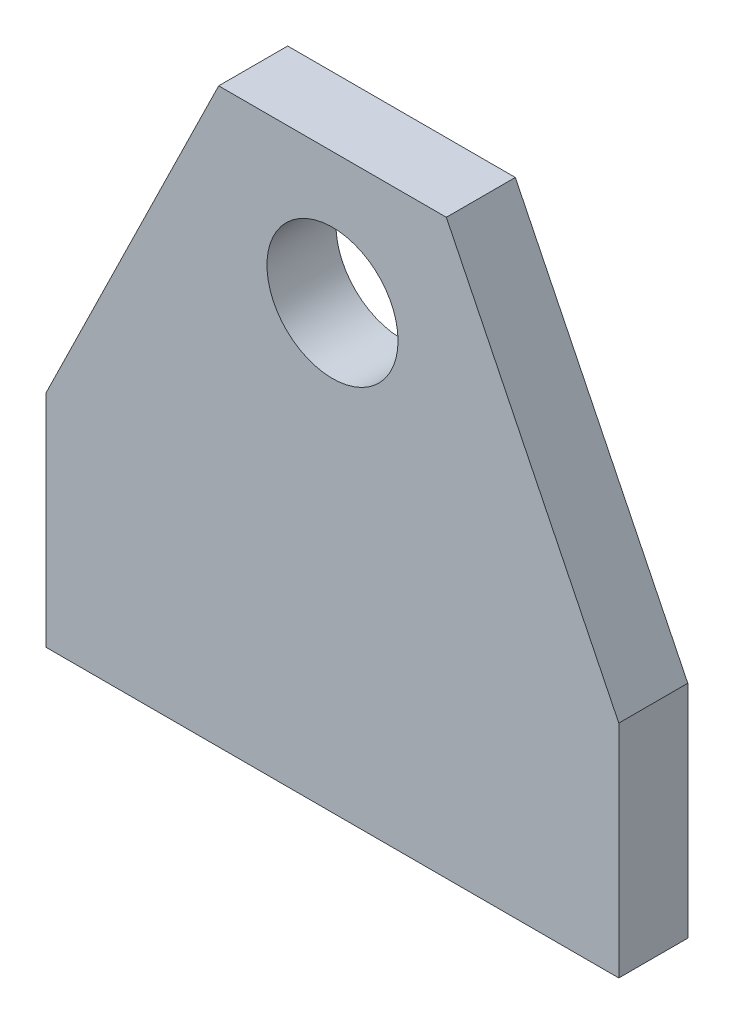
ISO-10303-21;
HEADER;
FILE_DESCRIPTION(('STEP AP214'),'2;1');
FILE_NAME('part.step','',(''),(''),'','','');
FILE_SCHEMA(('AUTOMOTIVE_DESIGN { 1 0 10303 214 1 1 1 1 }'));
ENDSEC;
DATA;
#1=APPLICATION_CONTEXT('core data for automotive mechanical design processes');
#2=APPLICATION_PROTOCOL_DEFINITION('international standard','automotive_design',2000,#1);
#3=PRODUCT_CONTEXT('',#1,'mechanical');
#4=PRODUCT('Part','Part','',(#3));
#5=PRODUCT_RELATED_PRODUCT_CATEGORY('part','',(#4));
#6=PRODUCT_DEFINITION_FORMATION('','',#4);
#7=PRODUCT_DEFINITION_CONTEXT('part definition',#1,'design');
#8=PRODUCT_DEFINITION('design','',#6,#7);
#9=PRODUCT_DEFINITION_SHAPE('','',#8);
#10=(LENGTH_UNIT() NAMED_UNIT(*) SI_UNIT(.MILLI.,.METRE.));
#11=(NAMED_UNIT(*) PLANE_ANGLE_UNIT() SI_UNIT($,.RADIAN.));
#12=(NAMED_UNIT(*) SI_UNIT($,.STERADIAN.) SOLID_ANGLE_UNIT());
#13=UNCERTAINTY_MEASURE_WITH_UNIT(LENGTH_MEASURE(1.E-05),#10,'distance_accuracy_value','');
#14=(GEOMETRIC_REPRESENTATION_CONTEXT(3) GLOBAL_UNCERTAINTY_ASSIGNED_CONTEXT((#13)) GLOBAL_UNIT_ASSIGNED_CONTEXT((#10,
#11,#12)) REPRESENTATION_CONTEXT('',''));
#15=CARTESIAN_POINT('',(0.,0.,0.));
#16=DIRECTION('',(0.,0.,1.));
#17=DIRECTION('',(1.,0.,0.));
#18=AXIS2_PLACEMENT_3D('',#15,#16,#17);
#19=CARTESIAN_POINT('',(41.5,0.,10.));
#20=DIRECTION('',(0.,0.,-1.));
#21=DIRECTION('',(-1.,0.,0.));
#22=AXIS2_PLACEMENT_3D('',#19,#20,#21);
#23=PLANE('',#22);
#24=DIRECTION('',(0.,-1.,0.));
#25=VECTOR('',#24,1.);
#26=CARTESIAN_POINT('',(41.5,32.,10.));
#27=LINE('',#26,#25);
#28=CARTESIAN_POINT('',(41.5,32.,10.));
#29=VERTEX_POINT('',#28);
#30=CARTESIAN_POINT('',(41.5,0.,10.));
#31=VERTEX_POINT('',#30);
#32=EDGE_CURVE('E130',#29,#31,#27,.T.);
#33=ORIENTED_EDGE('',*,*,#32,.F.);
#34=DIRECTION('',(0.440157217023029,-0.89792072272698,0.));
#35=VECTOR('',#34,1.);
#36=CARTESIAN_POINT('',(16.5,83.,10.));
#37=LINE('',#36,#35);
#38=CARTESIAN_POINT('',(16.5,83.,10.));
#39=VERTEX_POINT('',#38);
#40=EDGE_CURVE('E110',#39,#29,#37,.T.);
#41=ORIENTED_EDGE('',*,*,#40,.F.);
#42=DIRECTION('',(1.,0.,0.));
#43=VECTOR('',#42,1.);
#44=CARTESIAN_POINT('',(-16.5,83.,10.));
#45=LINE('',#44,#43);
#46=CARTESIAN_POINT('',(-16.5,83.,10.));
#47=VERTEX_POINT('',#46);
#48=EDGE_CURVE('E94',#47,#39,#45,.T.);
#49=ORIENTED_EDGE('',*,*,#48,.F.);
#50=DIRECTION('',(-0.440157217023029,-0.89792072272698,0.));
#51=VECTOR('',#50,1.);
#52=CARTESIAN_POINT('',(-16.5,83.,10.));
#53=LINE('',#52,#51);
#54=CARTESIAN_POINT('',(-41.5,32.,10.));
#55=VERTEX_POINT('',#54);
#56=EDGE_CURVE('E102',#47,#55,#53,.T.);
#57=ORIENTED_EDGE('',*,*,#56,.T.);
#58=DIRECTION('',(0.,-1.,0.));
#59=VECTOR('',#58,1.);
#60=CARTESIAN_POINT('',(-41.5,32.,10.));
#61=LINE('',#60,#59);
#62=CARTESIAN_POINT('',(-41.5,0.,10.));
#63=VERTEX_POINT('',#62);
#64=EDGE_CURVE('E107',#55,#63,#61,.T.);
#65=ORIENTED_EDGE('',*,*,#64,.T.);
#66=DIRECTION('',(-1.,0.,0.));
#67=VECTOR('',#66,1.);
#68=CARTESIAN_POINT('',(41.5,0.,10.));
#69=LINE('',#68,#67);
#70=EDGE_CURVE('E172',#31,#63,#69,.T.);
#71=ORIENTED_EDGE('',*,*,#70,.F.);
#72=EDGE_LOOP('',(#33,#41,#49,#57,#65,#71));
#73=FACE_BOUND('',#72,.T.);
#74=CARTESIAN_POINT('',(0.,64.,10.));
#75=DIRECTION('',(0.,0.,1.));
#76=DIRECTION('',(1.,0.,0.));
#77=AXIS2_PLACEMENT_3D('',#74,#75,#76);
#78=CIRCLE('',#77,9.5);
#79=CARTESIAN_POINT('',(9.5,64.,10.));
#80=VERTEX_POINT('',#79);
#81=EDGE_CURVE('E119',#80,#80,#78,.T.);
#82=ORIENTED_EDGE('',*,*,#81,.F.);
#83=EDGE_LOOP('',(#82));
#84=FACE_BOUND('',#83,.T.);
#85=ADVANCED_FACE('F32',(#73,#84),#23,.F.);
#86=CARTESIAN_POINT('',(41.5,0.,0.));
#87=DIRECTION('',(0.,0.,-1.));
#88=DIRECTION('',(-1.,0.,0.));
#89=AXIS2_PLACEMENT_3D('',#86,#87,#88);
#90=PLANE('',#89);
#91=DIRECTION('',(0.,-1.,0.));
#92=VECTOR('',#91,1.);
#93=CARTESIAN_POINT('',(41.5,32.,0.));
#94=LINE('',#93,#92);
#95=CARTESIAN_POINT('',(41.5,32.,0.));
#96=VERTEX_POINT('',#95);
#97=CARTESIAN_POINT('',(41.5,0.,0.));
#98=VERTEX_POINT('',#97);
#99=EDGE_CURVE('E115',#96,#98,#94,.T.);
#100=ORIENTED_EDGE('',*,*,#99,.T.);
#101=DIRECTION('',(-1.,0.,0.));
#102=VECTOR('',#101,1.);
#103=CARTESIAN_POINT('',(41.5,0.,0.));
#104=LINE('',#103,#102);
#105=CARTESIAN_POINT('',(-41.5,0.,0.));
#106=VERTEX_POINT('',#105);
#107=EDGE_CURVE('E118',#98,#106,#104,.T.);
#108=ORIENTED_EDGE('',*,*,#107,.T.);
#109=DIRECTION('',(0.,-1.,0.));
#110=VECTOR('',#109,1.);
#111=CARTESIAN_POINT('',(-41.5,32.,0.));
#112=LINE('',#111,#110);
#113=CARTESIAN_POINT('',(-41.5,32.,0.));
#114=VERTEX_POINT('',#113);
#115=EDGE_CURVE('E122',#114,#106,#112,.T.);
#116=ORIENTED_EDGE('',*,*,#115,.F.);
#117=DIRECTION('',(-0.440157217023029,-0.89792072272698,0.));
#118=VECTOR('',#117,1.);
#119=CARTESIAN_POINT('',(-16.5,83.,0.));
#120=LINE('',#119,#118);
#121=CARTESIAN_POINT('',(-16.5,83.,0.));
#122=VERTEX_POINT('',#121);
#123=EDGE_CURVE('E125',#122,#114,#120,.T.);
#124=ORIENTED_EDGE('',*,*,#123,.F.);
#125=DIRECTION('',(1.,0.,0.));
#126=VECTOR('',#125,1.);
#127=CARTESIAN_POINT('',(-16.5,83.,0.));
#128=LINE('',#127,#126);
#129=CARTESIAN_POINT('',(16.5,83.,0.));
#130=VERTEX_POINT('',#129);
#131=EDGE_CURVE('E96',#122,#130,#128,.T.);
#132=ORIENTED_EDGE('',*,*,#131,.T.);
#133=DIRECTION('',(0.440157217023029,-0.89792072272698,0.));
#134=VECTOR('',#133,1.);
#135=CARTESIAN_POINT('',(16.5,83.,0.));
#136=LINE('',#135,#134);
#137=EDGE_CURVE('E128',#130,#96,#136,.T.);
#138=ORIENTED_EDGE('',*,*,#137,.T.);
#139=EDGE_LOOP('',(#100,#108,#116,#124,#132,#138));
#140=FACE_BOUND('',#139,.T.);
#141=CARTESIAN_POINT('',(0.,64.,0.));
#142=DIRECTION('',(0.,0.,1.));
#143=DIRECTION('',(1.,0.,0.));
#144=AXIS2_PLACEMENT_3D('',#141,#142,#143);
#145=CIRCLE('',#144,9.5);
#146=CARTESIAN_POINT('',(9.5,64.,0.));
#147=VERTEX_POINT('',#146);
#148=EDGE_CURVE('E167',#147,#147,#145,.T.);
#149=ORIENTED_EDGE('',*,*,#148,.T.);
#150=EDGE_LOOP('',(#149));
#151=FACE_BOUND('',#150,.T.);
#152=ADVANCED_FACE('F138',(#140,#151),#90,.T.);
#153=CARTESIAN_POINT('',(41.5,32.,10.));
#154=DIRECTION('',(1.,0.,0.));
#155=DIRECTION('',(0.,1.,0.));
#156=AXIS2_PLACEMENT_3D('',#153,#154,#155);
#157=PLANE('',#156);
#158=ORIENTED_EDGE('',*,*,#99,.F.);
#159=DIRECTION('',(0.,0.,-1.));
#160=VECTOR('',#159,1.);
#161=CARTESIAN_POINT('',(41.5,32.,10.));
#162=LINE('',#161,#160);
#163=EDGE_CURVE('E11',#29,#96,#162,.T.);
#164=ORIENTED_EDGE('',*,*,#163,.F.);
#165=ORIENTED_EDGE('',*,*,#32,.T.);
#166=DIRECTION('',(0.,0.,-1.));
#167=VECTOR('',#166,1.);
#168=CARTESIAN_POINT('',(41.5,0.,10.));
#169=LINE('',#168,#167);
#170=EDGE_CURVE('E36',#31,#98,#169,.T.);
#171=ORIENTED_EDGE('',*,*,#170,.T.);
#172=EDGE_LOOP('',(#158,#164,#165,#171));
#173=FACE_BOUND('',#172,.T.);
#174=ADVANCED_FACE('F34',(#173),#157,.T.);
#175=CARTESIAN_POINT('',(16.5,83.,10.));
#176=DIRECTION('',(0.89792072272698,0.440157217023029,0.));
#177=DIRECTION('',(-0.44015721702303,0.89792072272698,0.));
#178=AXIS2_PLACEMENT_3D('',#175,#176,#177);
#179=PLANE('',#178);
#180=ORIENTED_EDGE('',*,*,#137,.F.);
#181=DIRECTION('',(0.,0.,-1.));
#182=VECTOR('',#181,1.);
#183=CARTESIAN_POINT('',(16.5,83.,10.));
#184=LINE('',#183,#182);
#185=EDGE_CURVE('E42',#39,#130,#184,.T.);
#186=ORIENTED_EDGE('',*,*,#185,.F.);
#187=ORIENTED_EDGE('',*,*,#40,.T.);
#188=ORIENTED_EDGE('',*,*,#163,.T.);
#189=EDGE_LOOP('',(#180,#186,#187,#188));
#190=FACE_BOUND('',#189,.T.);
#191=ADVANCED_FACE('F140',(#190),#179,.T.);
#192=CARTESIAN_POINT('',(-16.5,83.,10.));
#193=DIRECTION('',(0.,1.,0.));
#194=DIRECTION('',(0.,0.,1.));
#195=AXIS2_PLACEMENT_3D('',#192,#193,#194);
#196=PLANE('',#195);
#197=ORIENTED_EDGE('',*,*,#131,.F.);
#198=DIRECTION('',(0.,0.,-1.));
#199=VECTOR('',#198,1.);
#200=CARTESIAN_POINT('',(-16.5,83.,10.));
#201=LINE('',#200,#199);
#202=EDGE_CURVE('E90',#47,#122,#201,.T.);
#203=ORIENTED_EDGE('',*,*,#202,.F.);
#204=ORIENTED_EDGE('',*,*,#48,.T.);
#205=ORIENTED_EDGE('',*,*,#185,.T.);
#206=EDGE_LOOP('',(#197,#203,#204,#205));
#207=FACE_BOUND('',#206,.T.);
#208=ADVANCED_FACE('F92',(#207),#196,.T.);
#209=CARTESIAN_POINT('',(-16.5,83.,10.));
#210=DIRECTION('',(0.89792072272698,-0.440157217023029,0.));
#211=DIRECTION('',(0.44015721702303,0.89792072272698,0.));
#212=AXIS2_PLACEMENT_3D('',#209,#210,#211);
#213=PLANE('',#212);
#214=ORIENTED_EDGE('',*,*,#123,.T.);
#215=DIRECTION('',(0.,0.,-1.));
#216=VECTOR('',#215,1.);
#217=CARTESIAN_POINT('',(-41.5,32.,10.));
#218=LINE('',#217,#216);
#219=EDGE_CURVE('E99',#55,#114,#218,.T.);
#220=ORIENTED_EDGE('',*,*,#219,.F.);
#221=ORIENTED_EDGE('',*,*,#56,.F.);
#222=ORIENTED_EDGE('',*,*,#202,.T.);
#223=EDGE_LOOP('',(#214,#220,#221,#222));
#224=FACE_BOUND('',#223,.T.);
#225=ADVANCED_FACE('F103',(#224),#213,.F.);
#226=CARTESIAN_POINT('',(-41.5,32.,10.));
#227=DIRECTION('',(1.,0.,0.));
#228=DIRECTION('',(0.,1.,0.));
#229=AXIS2_PLACEMENT_3D('',#226,#227,#228);
#230=PLANE('',#229);
#231=ORIENTED_EDGE('',*,*,#115,.T.);
#232=DIRECTION('',(0.,0.,-1.));
#233=VECTOR('',#232,1.);
#234=CARTESIAN_POINT('',(-41.5,0.,10.));
#235=LINE('',#234,#233);
#236=EDGE_CURVE('E133',#63,#106,#235,.T.);
#237=ORIENTED_EDGE('',*,*,#236,.F.);
#238=ORIENTED_EDGE('',*,*,#64,.F.);
#239=ORIENTED_EDGE('',*,*,#219,.T.);
#240=EDGE_LOOP('',(#231,#237,#238,#239));
#241=FACE_BOUND('',#240,.T.);
#242=ADVANCED_FACE('F161',(#241),#230,.F.);
#243=CARTESIAN_POINT('',(41.5,0.,10.));
#244=DIRECTION('',(0.,-1.,0.));
#245=DIRECTION('',(0.,0.,-1.));
#246=AXIS2_PLACEMENT_3D('',#243,#244,#245);
#247=PLANE('',#246);
#248=ORIENTED_EDGE('',*,*,#107,.F.);
#249=ORIENTED_EDGE('',*,*,#170,.F.);
#250=ORIENTED_EDGE('',*,*,#70,.T.);
#251=ORIENTED_EDGE('',*,*,#236,.T.);
#252=EDGE_LOOP('',(#248,#249,#250,#251));
#253=FACE_BOUND('',#252,.T.);
#254=ADVANCED_FACE('F135',(#253),#247,.T.);
#255=CARTESIAN_POINT('',(0.,64.,10.));
#256=DIRECTION('',(0.,0.,-1.));
#257=DIRECTION('',(-1.,0.,0.));
#258=AXIS2_PLACEMENT_3D('',#255,#256,#257);
#259=CYLINDRICAL_SURFACE('',#258,9.5);
#260=ORIENTED_EDGE('',*,*,#81,.T.);
#261=EDGE_LOOP('',(#260));
#262=FACE_BOUND('',#261,.T.);
#263=ORIENTED_EDGE('',*,*,#148,.F.);
#264=EDGE_LOOP('',(#263));
#265=FACE_BOUND('',#264,.T.);
#266=ADVANCED_FACE('F155',(#262,#265),#259,.F.);
#267=CLOSED_SHELL('',(#85,#152,#174,#191,#208,#225,#242,#254,#266));
#268=MANIFOLD_SOLID_BREP('B2',#267);
#269=ADVANCED_BREP_SHAPE_REPRESENTATION('',(#18,#268),#14);
#270=SHAPE_DEFINITION_REPRESENTATION(#9,#269);
ENDSEC;
END-ISO-10303-21;
